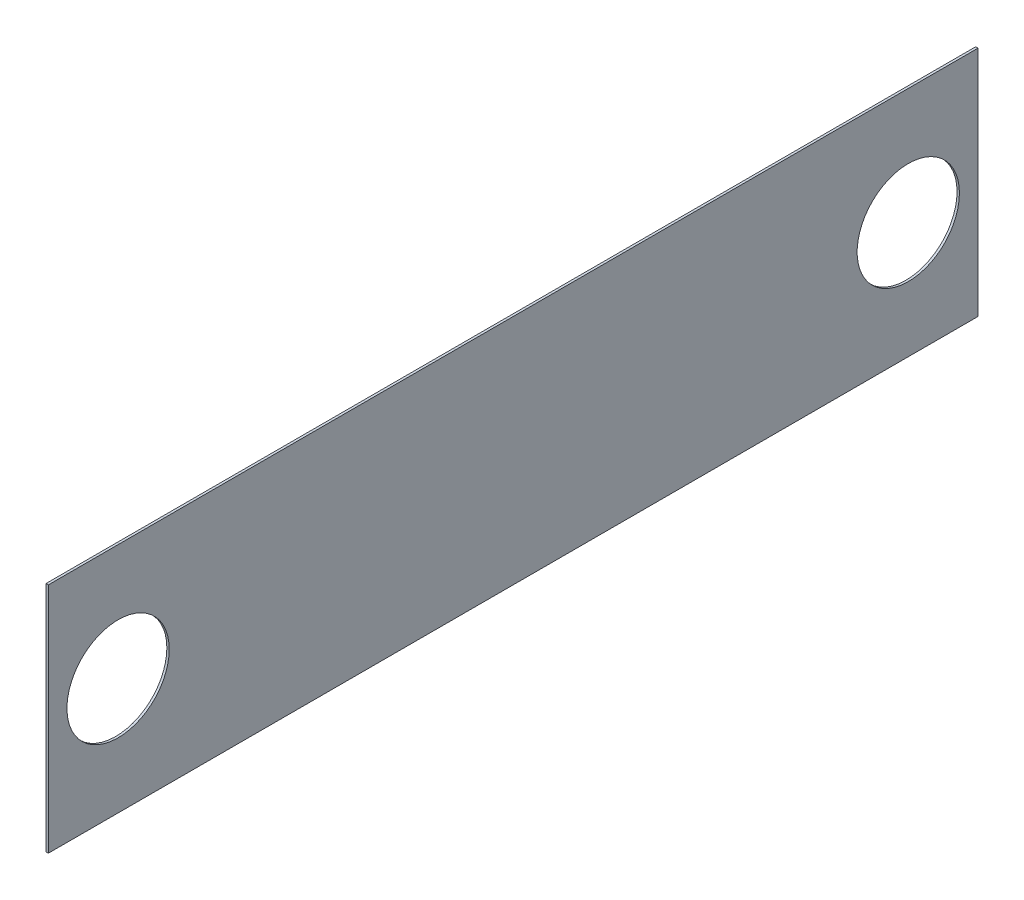
ISO-10303-21;
HEADER;
FILE_DESCRIPTION(('STEP AP214'),'2;1');
FILE_NAME('part.step','',(''),(''),'','','');
FILE_SCHEMA(('AUTOMOTIVE_DESIGN { 1 0 10303 214 1 1 1 1 }'));
ENDSEC;
DATA;
#1=APPLICATION_CONTEXT('core data for automotive mechanical design processes');
#2=APPLICATION_PROTOCOL_DEFINITION('international standard','automotive_design',2000,#1);
#3=PRODUCT_CONTEXT('',#1,'mechanical');
#4=PRODUCT('Part','Part','',(#3));
#5=PRODUCT_RELATED_PRODUCT_CATEGORY('part','',(#4));
#6=PRODUCT_DEFINITION_FORMATION('','',#4);
#7=PRODUCT_DEFINITION_CONTEXT('part definition',#1,'design');
#8=PRODUCT_DEFINITION('design','',#6,#7);
#9=PRODUCT_DEFINITION_SHAPE('','',#8);
#10=(LENGTH_UNIT() NAMED_UNIT(*) SI_UNIT(.MILLI.,.METRE.));
#11=(NAMED_UNIT(*) PLANE_ANGLE_UNIT() SI_UNIT($,.RADIAN.));
#12=(NAMED_UNIT(*) SI_UNIT($,.STERADIAN.) SOLID_ANGLE_UNIT());
#13=UNCERTAINTY_MEASURE_WITH_UNIT(LENGTH_MEASURE(1.E-05),#10,'distance_accuracy_value','');
#14=(GEOMETRIC_REPRESENTATION_CONTEXT(3) GLOBAL_UNCERTAINTY_ASSIGNED_CONTEXT((#13)) GLOBAL_UNIT_ASSIGNED_CONTEXT((#10,
#11,#12)) REPRESENTATION_CONTEXT('',''));
#15=CARTESIAN_POINT('',(0.,0.,0.));
#16=DIRECTION('',(0.,0.,1.));
#17=DIRECTION('',(1.,0.,0.));
#18=AXIS2_PLACEMENT_3D('',#15,#16,#17);
#19=CARTESIAN_POINT('',(0.254,12.5,50.));
#20=DIRECTION('',(0.,0.,-1.));
#21=DIRECTION('',(-1.,0.,0.));
#22=AXIS2_PLACEMENT_3D('',#19,#20,#21);
#23=PLANE('',#22);
#24=DIRECTION('',(0.,-1.,0.));
#25=VECTOR('',#24,1.);
#26=CARTESIAN_POINT('',(0.,12.5,50.));
#27=LINE('',#26,#25);
#28=CARTESIAN_POINT('',(0.,12.5,50.));
#29=VERTEX_POINT('',#28);
#30=CARTESIAN_POINT('',(0.,-12.5,50.));
#31=VERTEX_POINT('',#30);
#32=EDGE_CURVE('E97',#29,#31,#27,.T.);
#33=ORIENTED_EDGE('',*,*,#32,.T.);
#34=DIRECTION('',(-1.,0.,0.));
#35=VECTOR('',#34,1.);
#36=CARTESIAN_POINT('',(0.254,-12.5,50.));
#37=LINE('',#36,#35);
#38=CARTESIAN_POINT('',(0.254,-12.5,50.));
#39=VERTEX_POINT('',#38);
#40=EDGE_CURVE('E11',#39,#31,#37,.T.);
#41=ORIENTED_EDGE('',*,*,#40,.F.);
#42=DIRECTION('',(0.,-1.,0.));
#43=VECTOR('',#42,1.);
#44=CARTESIAN_POINT('',(0.254,12.5,50.));
#45=LINE('',#44,#43);
#46=CARTESIAN_POINT('',(0.254,12.5,50.));
#47=VERTEX_POINT('',#46);
#48=EDGE_CURVE('E85',#47,#39,#45,.T.);
#49=ORIENTED_EDGE('',*,*,#48,.F.);
#50=DIRECTION('',(-1.,0.,0.));
#51=VECTOR('',#50,1.);
#52=CARTESIAN_POINT('',(0.254,12.5,50.));
#53=LINE('',#52,#51);
#54=EDGE_CURVE('E93',#47,#29,#53,.T.);
#55=ORIENTED_EDGE('',*,*,#54,.T.);
#56=EDGE_LOOP('',(#33,#41,#49,#55));
#57=FACE_BOUND('',#56,.T.);
#58=ADVANCED_FACE('F34',(#57),#23,.F.);
#59=CARTESIAN_POINT('',(0.254,-12.5,50.));
#60=DIRECTION('',(0.,1.,0.));
#61=DIRECTION('',(0.,0.,1.));
#62=AXIS2_PLACEMENT_3D('',#59,#60,#61);
#63=PLANE('',#62);
#64=DIRECTION('',(0.,0.,-1.));
#65=VECTOR('',#64,1.);
#66=CARTESIAN_POINT('',(0.,-12.5,50.));
#67=LINE('',#66,#65);
#68=CARTESIAN_POINT('',(0.,-12.5,-50.));
#69=VERTEX_POINT('',#68);
#70=EDGE_CURVE('E89',#31,#69,#67,.T.);
#71=ORIENTED_EDGE('',*,*,#70,.T.);
#72=DIRECTION('',(-1.,0.,0.));
#73=VECTOR('',#72,1.);
#74=CARTESIAN_POINT('',(0.254,-12.5,-50.));
#75=LINE('',#74,#73);
#76=CARTESIAN_POINT('',(0.254,-12.5,-50.));
#77=VERTEX_POINT('',#76);
#78=EDGE_CURVE('E42',#77,#69,#75,.T.);
#79=ORIENTED_EDGE('',*,*,#78,.F.);
#80=DIRECTION('',(0.,0.,-1.));
#81=VECTOR('',#80,1.);
#82=CARTESIAN_POINT('',(0.254,-12.5,50.));
#83=LINE('',#82,#81);
#84=EDGE_CURVE('E80',#39,#77,#83,.T.);
#85=ORIENTED_EDGE('',*,*,#84,.F.);
#86=ORIENTED_EDGE('',*,*,#40,.T.);
#87=EDGE_LOOP('',(#71,#79,#85,#86));
#88=FACE_BOUND('',#87,.T.);
#89=ADVANCED_FACE('F88',(#88),#63,.F.);
#90=CARTESIAN_POINT('',(0.254,12.5,-50.));
#91=DIRECTION('',(0.,0.,1.));
#92=DIRECTION('',(1.,0.,0.));
#93=AXIS2_PLACEMENT_3D('',#90,#91,#92);
#94=PLANE('',#93);
#95=DIRECTION('',(0.,1.,0.));
#96=VECTOR('',#95,1.);
#97=CARTESIAN_POINT('',(0.,12.5,-50.));
#98=LINE('',#97,#96);
#99=CARTESIAN_POINT('',(0.,12.5,-50.));
#100=VERTEX_POINT('',#99);
#101=EDGE_CURVE('E67',#69,#100,#98,.T.);
#102=ORIENTED_EDGE('',*,*,#101,.T.);
#103=DIRECTION('',(-1.,0.,0.));
#104=VECTOR('',#103,1.);
#105=CARTESIAN_POINT('',(0.254,12.5,-50.));
#106=LINE('',#105,#104);
#107=CARTESIAN_POINT('',(0.254,12.5,-50.));
#108=VERTEX_POINT('',#107);
#109=EDGE_CURVE('E90',#108,#100,#106,.T.);
#110=ORIENTED_EDGE('',*,*,#109,.F.);
#111=DIRECTION('',(0.,1.,0.));
#112=VECTOR('',#111,1.);
#113=CARTESIAN_POINT('',(0.254,12.5,-50.));
#114=LINE('',#113,#112);
#115=EDGE_CURVE('E83',#77,#108,#114,.T.);
#116=ORIENTED_EDGE('',*,*,#115,.F.);
#117=ORIENTED_EDGE('',*,*,#78,.T.);
#118=EDGE_LOOP('',(#102,#110,#116,#117));
#119=FACE_BOUND('',#118,.T.);
#120=ADVANCED_FACE('F91',(#119),#94,.F.);
#121=CARTESIAN_POINT('',(0.254,12.5,50.));
#122=DIRECTION('',(0.,-1.,0.));
#123=DIRECTION('',(0.,0.,-1.));
#124=AXIS2_PLACEMENT_3D('',#121,#122,#123);
#125=PLANE('',#124);
#126=DIRECTION('',(0.,0.,1.));
#127=VECTOR('',#126,1.);
#128=CARTESIAN_POINT('',(0.,12.5,50.));
#129=LINE('',#128,#127);
#130=EDGE_CURVE('E73',#100,#29,#129,.T.);
#131=ORIENTED_EDGE('',*,*,#130,.T.);
#132=ORIENTED_EDGE('',*,*,#54,.F.);
#133=DIRECTION('',(0.,0.,1.));
#134=VECTOR('',#133,1.);
#135=CARTESIAN_POINT('',(0.254,12.5,50.));
#136=LINE('',#135,#134);
#137=EDGE_CURVE('E50',#108,#47,#136,.T.);
#138=ORIENTED_EDGE('',*,*,#137,.F.);
#139=ORIENTED_EDGE('',*,*,#109,.T.);
#140=EDGE_LOOP('',(#131,#132,#138,#139));
#141=FACE_BOUND('',#140,.T.);
#142=ADVANCED_FACE('F105',(#141),#125,.F.);
#143=CARTESIAN_POINT('',(0.254,0.,0.));
#144=DIRECTION('',(1.,0.,0.));
#145=DIRECTION('',(0.,0.,-1.));
#146=AXIS2_PLACEMENT_3D('',#143,#144,#145);
#147=PLANE('',#146);
#148=CARTESIAN_POINT('',(0.254000000000001,0.,42.5));
#149=DIRECTION('',(1.,0.,0.));
#150=DIRECTION('',(0.,0.,-1.));
#151=AXIS2_PLACEMENT_3D('',#148,#149,#150);
#152=CIRCLE('',#151,5.5);
#153=CARTESIAN_POINT('',(0.254000000000001,0.,37.));
#154=VERTEX_POINT('',#153);
#155=EDGE_CURVE('E119',#154,#154,#152,.T.);
#156=ORIENTED_EDGE('',*,*,#155,.F.);
#157=EDGE_LOOP('',(#156));
#158=FACE_BOUND('',#157,.T.);
#159=CARTESIAN_POINT('',(0.254000000000001,0.,-42.5));
#160=DIRECTION('',(1.,0.,0.));
#161=DIRECTION('',(0.,0.,-1.));
#162=AXIS2_PLACEMENT_3D('',#159,#160,#161);
#163=CIRCLE('',#162,5.5);
#164=CARTESIAN_POINT('',(0.254000000000001,0.,-48.));
#165=VERTEX_POINT('',#164);
#166=EDGE_CURVE('E113',#165,#165,#163,.T.);
#167=ORIENTED_EDGE('',*,*,#166,.F.);
#168=EDGE_LOOP('',(#167));
#169=FACE_BOUND('',#168,.T.);
#170=ORIENTED_EDGE('',*,*,#48,.T.);
#171=ORIENTED_EDGE('',*,*,#84,.T.);
#172=ORIENTED_EDGE('',*,*,#115,.T.);
#173=ORIENTED_EDGE('',*,*,#137,.T.);
#174=EDGE_LOOP('',(#170,#171,#172,#173));
#175=FACE_BOUND('',#174,.T.);
#176=ADVANCED_FACE('F81',(#158,#169,#175),#147,.T.);
#177=CARTESIAN_POINT('',(0.,0.,0.));
#178=DIRECTION('',(1.,0.,0.));
#179=DIRECTION('',(0.,0.,-1.));
#180=AXIS2_PLACEMENT_3D('',#177,#178,#179);
#181=PLANE('',#180);
#182=CARTESIAN_POINT('',(0.,0.,42.5));
#183=DIRECTION('',(1.,0.,0.));
#184=DIRECTION('',(0.,0.,-1.));
#185=AXIS2_PLACEMENT_3D('',#182,#183,#184);
#186=CIRCLE('',#185,5.5);
#187=CARTESIAN_POINT('',(0.,0.,37.));
#188=VERTEX_POINT('',#187);
#189=EDGE_CURVE('E116',#188,#188,#186,.T.);
#190=ORIENTED_EDGE('',*,*,#189,.T.);
#191=EDGE_LOOP('',(#190));
#192=FACE_BOUND('',#191,.T.);
#193=CARTESIAN_POINT('',(0.,0.,-42.5));
#194=DIRECTION('',(1.,0.,0.));
#195=DIRECTION('',(0.,0.,-1.));
#196=AXIS2_PLACEMENT_3D('',#193,#194,#195);
#197=CIRCLE('',#196,5.5);
#198=CARTESIAN_POINT('',(0.,0.,-48.));
#199=VERTEX_POINT('',#198);
#200=EDGE_CURVE('E100',#199,#199,#197,.T.);
#201=ORIENTED_EDGE('',*,*,#200,.T.);
#202=EDGE_LOOP('',(#201));
#203=FACE_BOUND('',#202,.T.);
#204=ORIENTED_EDGE('',*,*,#32,.F.);
#205=ORIENTED_EDGE('',*,*,#130,.F.);
#206=ORIENTED_EDGE('',*,*,#101,.F.);
#207=ORIENTED_EDGE('',*,*,#70,.F.);
#208=EDGE_LOOP('',(#204,#205,#206,#207));
#209=FACE_BOUND('',#208,.T.);
#210=ADVANCED_FACE('F108',(#192,#203,#209),#181,.F.);
#211=CARTESIAN_POINT('',(0.254,0.,-42.5));
#212=DIRECTION('',(1.,0.,0.));
#213=DIRECTION('',(0.,0.,-1.));
#214=AXIS2_PLACEMENT_3D('',#211,#212,#213);
#215=CYLINDRICAL_SURFACE('',#214,5.5);
#216=ORIENTED_EDGE('',*,*,#200,.F.);
#217=EDGE_LOOP('',(#216));
#218=FACE_BOUND('',#217,.T.);
#219=ORIENTED_EDGE('',*,*,#166,.T.);
#220=EDGE_LOOP('',(#219));
#221=FACE_BOUND('',#220,.T.);
#222=ADVANCED_FACE('F130',(#218,#221),#215,.F.);
#223=CARTESIAN_POINT('',(0.254,0.,42.5));
#224=DIRECTION('',(1.,0.,0.));
#225=DIRECTION('',(0.,0.,-1.));
#226=AXIS2_PLACEMENT_3D('',#223,#224,#225);
#227=CYLINDRICAL_SURFACE('',#226,5.5);
#228=ORIENTED_EDGE('',*,*,#189,.F.);
#229=EDGE_LOOP('',(#228));
#230=FACE_BOUND('',#229,.T.);
#231=ORIENTED_EDGE('',*,*,#155,.T.);
#232=EDGE_LOOP('',(#231));
#233=FACE_BOUND('',#232,.T.);
#234=ADVANCED_FACE('F123',(#230,#233),#227,.F.);
#235=CLOSED_SHELL('',(#58,#89,#120,#142,#176,#210,#222,#234));
#236=MANIFOLD_SOLID_BREP('B2',#235);
#237=ADVANCED_BREP_SHAPE_REPRESENTATION('',(#18,#236),#14);
#238=SHAPE_DEFINITION_REPRESENTATION(#9,#237);
ENDSEC;
END-ISO-10303-21;
